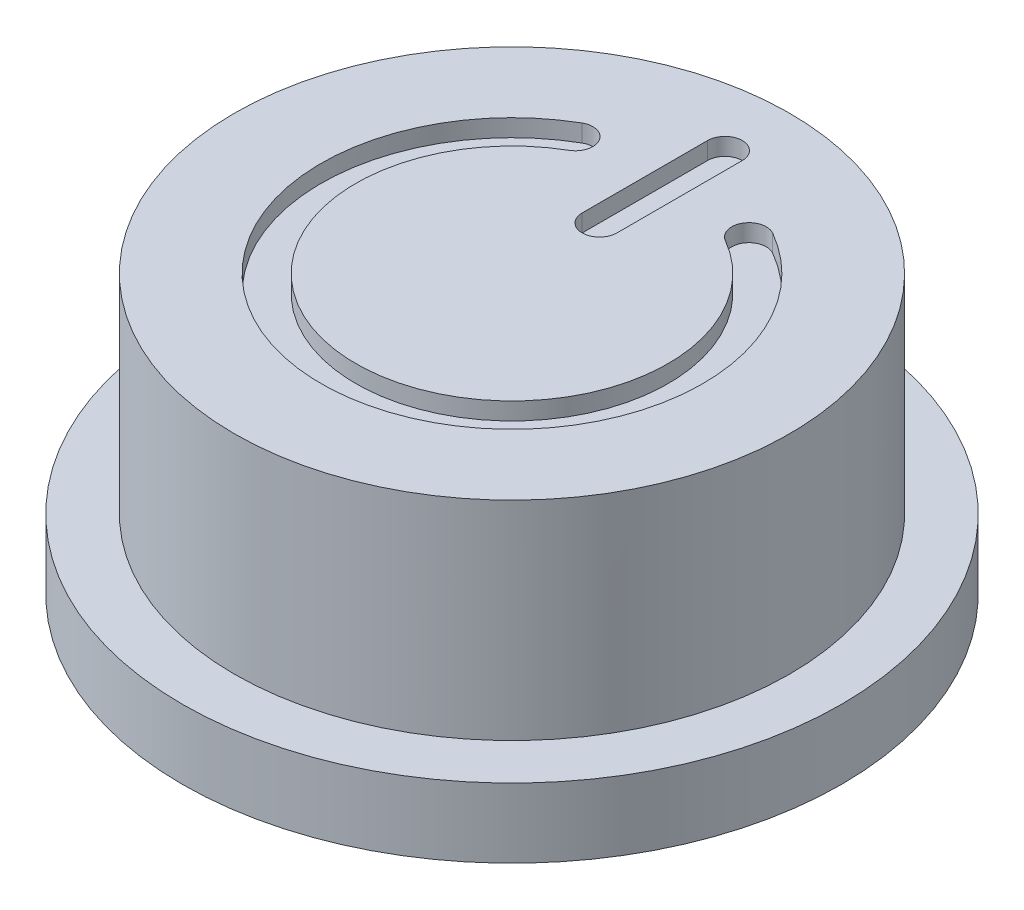
ISO-10303-21;
HEADER;
FILE_DESCRIPTION(('STEP AP214'),'2;1');
FILE_NAME('part.step','',(''),(''),'','','');
FILE_SCHEMA(('AUTOMOTIVE_DESIGN { 1 0 10303 214 1 1 1 1 }'));
ENDSEC;
DATA;
#1=APPLICATION_CONTEXT('core data for automotive mechanical design processes');
#2=APPLICATION_PROTOCOL_DEFINITION('international standard','automotive_design',2000,#1);
#3=PRODUCT_CONTEXT('',#1,'mechanical');
#4=PRODUCT('Part','Part','',(#3));
#5=PRODUCT_RELATED_PRODUCT_CATEGORY('part','',(#4));
#6=PRODUCT_DEFINITION_FORMATION('','',#4);
#7=PRODUCT_DEFINITION_CONTEXT('part definition',#1,'design');
#8=PRODUCT_DEFINITION('design','',#6,#7);
#9=PRODUCT_DEFINITION_SHAPE('','',#8);
#10=(LENGTH_UNIT() NAMED_UNIT(*) SI_UNIT(.MILLI.,.METRE.));
#11=(NAMED_UNIT(*) PLANE_ANGLE_UNIT() SI_UNIT($,.RADIAN.));
#12=(NAMED_UNIT(*) SI_UNIT($,.STERADIAN.) SOLID_ANGLE_UNIT());
#13=UNCERTAINTY_MEASURE_WITH_UNIT(LENGTH_MEASURE(1.E-05),#10,'distance_accuracy_value','');
#14=(GEOMETRIC_REPRESENTATION_CONTEXT(3) GLOBAL_UNCERTAINTY_ASSIGNED_CONTEXT((#13)) GLOBAL_UNIT_ASSIGNED_CONTEXT((#10,
#11,#12)) REPRESENTATION_CONTEXT('',''));
#15=CARTESIAN_POINT('',(0.,0.,0.));
#16=DIRECTION('',(0.,0.,1.));
#17=DIRECTION('',(1.,0.,0.));
#18=AXIS2_PLACEMENT_3D('',#15,#16,#17);
#19=CARTESIAN_POINT('',(0.,6.,0.));
#20=DIRECTION('',(0.,-1.,0.));
#21=DIRECTION('',(0.,0.,-1.));
#22=AXIS2_PLACEMENT_3D('',#19,#20,#21);
#23=CYLINDRICAL_SURFACE('',#22,8.);
#24=DIRECTION('',(0.,-1.,0.));
#25=VECTOR('',#24,1.);
#26=CARTESIAN_POINT('',(-1.24999999999999,6.,-7.90174031463955));
#27=LINE('',#26,#25);
#28=CARTESIAN_POINT('',(-1.24999999999999,0.,-7.90174031463955));
#29=VERTEX_POINT('',#28);
#30=CARTESIAN_POINT('',(-1.24999999999999,-2.,-7.90174031463955));
#31=VERTEX_POINT('',#30);
#32=EDGE_CURVE('E196',#29,#31,#27,.T.);
#33=ORIENTED_EDGE('',*,*,#32,.F.);
#34=CARTESIAN_POINT('',(0.,0.,0.));
#35=DIRECTION('',(0.,-1.,0.));
#36=DIRECTION('',(0.,0.,-1.));
#37=AXIS2_PLACEMENT_3D('',#34,#35,#36);
#38=CIRCLE('',#37,8.);
#39=CARTESIAN_POINT('',(1.25,0.,-7.90174031463955));
#40=VERTEX_POINT('',#39);
#41=EDGE_CURVE('E221',#40,#29,#38,.T.);
#42=ORIENTED_EDGE('',*,*,#41,.F.);
#43=DIRECTION('',(0.,-1.,0.));
#44=VECTOR('',#43,1.);
#45=CARTESIAN_POINT('',(1.25,6.,-7.90174031463955));
#46=LINE('',#45,#44);
#47=CARTESIAN_POINT('',(1.25,-2.,-7.90174031463955));
#48=VERTEX_POINT('',#47);
#49=EDGE_CURVE('E195',#40,#48,#46,.T.);
#50=ORIENTED_EDGE('',*,*,#49,.T.);
#51=CARTESIAN_POINT('',(0.,-2.,0.));
#52=DIRECTION('',(0.,1.,0.));
#53=DIRECTION('',(0.,0.,1.));
#54=AXIS2_PLACEMENT_3D('',#51,#52,#53);
#55=CIRCLE('',#54,8.);
#56=EDGE_CURVE('E192',#48,#31,#55,.T.);
#57=ORIENTED_EDGE('',*,*,#56,.T.);
#58=EDGE_LOOP('',(#33,#42,#50,#57));
#59=FACE_BOUND('',#58,.T.);
#60=CARTESIAN_POINT('',(0.,6.,0.));
#61=DIRECTION('',(0.,1.,0.));
#62=DIRECTION('',(0.,0.,1.));
#63=AXIS2_PLACEMENT_3D('',#60,#61,#62);
#64=CIRCLE('',#63,8.);
#65=CARTESIAN_POINT('',(0.,6.,8.));
#66=VERTEX_POINT('',#65);
#67=EDGE_CURVE('E226',#66,#66,#64,.T.);
#68=ORIENTED_EDGE('',*,*,#67,.F.);
#69=EDGE_LOOP('',(#68));
#70=FACE_BOUND('',#69,.T.);
#71=ADVANCED_FACE('F33',(#59,#70),#23,.T.);
#72=CARTESIAN_POINT('',(0.,6.,0.));
#73=DIRECTION('',(0.,1.,0.));
#74=DIRECTION('',(0.,0.,1.));
#75=AXIS2_PLACEMENT_3D('',#72,#73,#74);
#76=PLANE('',#75);
#77=CARTESIAN_POINT('',(0.,6.,-6.13682895226834));
#78=DIRECTION('',(0.,1.,0.));
#79=DIRECTION('',(0.,0.,1.));
#80=AXIS2_PLACEMENT_3D('',#77,#78,#79);
#81=CIRCLE('',#80,0.5);
#82=CARTESIAN_POINT('',(0.500000000000001,6.,-6.13682895226834));
#83=VERTEX_POINT('',#82);
#84=CARTESIAN_POINT('',(-0.499999999999999,6.,-6.13682895226834));
#85=VERTEX_POINT('',#84);
#86=EDGE_CURVE('E48',#83,#85,#81,.T.);
#87=ORIENTED_EDGE('',*,*,#86,.F.);
#88=DIRECTION('',(0.,0.,-1.));
#89=VECTOR('',#88,1.);
#90=CARTESIAN_POINT('',(0.500000000000001,6.,-6.13682895226834));
#91=LINE('',#90,#89);
#92=CARTESIAN_POINT('',(0.500000000000001,6.,-2.52342508557605));
#93=VERTEX_POINT('',#92);
#94=EDGE_CURVE('E142',#93,#83,#91,.T.);
#95=ORIENTED_EDGE('',*,*,#94,.F.);
#96=CARTESIAN_POINT('',(0.,6.,-2.52342508557605));
#97=DIRECTION('',(0.,1.,0.));
#98=DIRECTION('',(0.,0.,1.));
#99=AXIS2_PLACEMENT_3D('',#96,#97,#98);
#100=CIRCLE('',#99,0.5);
#101=CARTESIAN_POINT('',(-0.5,6.,-2.52342508557605));
#102=VERTEX_POINT('',#101);
#103=EDGE_CURVE('E145',#102,#93,#100,.T.);
#104=ORIENTED_EDGE('',*,*,#103,.F.);
#105=DIRECTION('',(0.,0.,1.));
#106=VECTOR('',#105,1.);
#107=CARTESIAN_POINT('',(-0.499999999999999,6.,-6.13682895226834));
#108=LINE('',#107,#106);
#109=EDGE_CURVE('E151',#85,#102,#108,.T.);
#110=ORIENTED_EDGE('',*,*,#109,.F.);
#111=EDGE_LOOP('',(#87,#95,#104,#110));
#112=FACE_BOUND('',#111,.T.);
#113=CARTESIAN_POINT('',(-2.5,6.,-4.33012701892219));
#114=DIRECTION('',(0.,1.,0.));
#115=DIRECTION('',(0.,0.,1.));
#116=AXIS2_PLACEMENT_3D('',#113,#114,#115);
#117=CIRCLE('',#116,0.499999999999998);
#118=CARTESIAN_POINT('',(-2.25,6.,-3.89711431702998));
#119=VERTEX_POINT('',#118);
#120=CARTESIAN_POINT('',(-2.75,6.,-4.76313972081441));
#121=VERTEX_POINT('',#120);
#122=EDGE_CURVE('E56',#119,#121,#117,.T.);
#123=ORIENTED_EDGE('',*,*,#122,.F.);
#124=CARTESIAN_POINT('',(0.,6.,0.));
#125=DIRECTION('',(0.,-1.,0.));
#126=DIRECTION('',(0.,0.,1.));
#127=AXIS2_PLACEMENT_3D('',#124,#125,#126);
#128=CIRCLE('',#127,4.5);
#129=CARTESIAN_POINT('',(2.25,6.,-3.89711431702997));
#130=VERTEX_POINT('',#129);
#131=EDGE_CURVE('E164',#130,#119,#128,.T.);
#132=ORIENTED_EDGE('',*,*,#131,.F.);
#133=CARTESIAN_POINT('',(2.5,6.,-4.33012701892219));
#134=DIRECTION('',(0.,1.,0.));
#135=DIRECTION('',(0.,0.,1.));
#136=AXIS2_PLACEMENT_3D('',#133,#134,#135);
#137=CIRCLE('',#136,0.499999999999998);
#138=CARTESIAN_POINT('',(2.75,6.,-4.76313972081441));
#139=VERTEX_POINT('',#138);
#140=EDGE_CURVE('E178',#139,#130,#137,.T.);
#141=ORIENTED_EDGE('',*,*,#140,.F.);
#142=CARTESIAN_POINT('',(0.,6.,0.));
#143=DIRECTION('',(0.,1.,0.));
#144=DIRECTION('',(0.,0.,1.));
#145=AXIS2_PLACEMENT_3D('',#142,#143,#144);
#146=CIRCLE('',#145,5.5);
#147=EDGE_CURVE('E175',#121,#139,#146,.T.);
#148=ORIENTED_EDGE('',*,*,#147,.F.);
#149=EDGE_LOOP('',(#123,#132,#141,#148));
#150=FACE_BOUND('',#149,.T.);
#151=ORIENTED_EDGE('',*,*,#67,.T.);
#152=EDGE_LOOP('',(#151));
#153=FACE_BOUND('',#152,.T.);
#154=ADVANCED_FACE('F269',(#112,#150,#153),#76,.T.);
#155=CARTESIAN_POINT('',(0.,0.,0.));
#156=DIRECTION('',(0.,-1.,0.));
#157=DIRECTION('',(0.,0.,-1.));
#158=AXIS2_PLACEMENT_3D('',#155,#156,#157);
#159=PLANE('',#158);
#160=ORIENTED_EDGE('',*,*,#41,.T.);
#161=DIRECTION('',(0.,0.,-1.));
#162=VECTOR('',#161,1.);
#163=CARTESIAN_POINT('',(-1.25,0.,0.));
#164=LINE('',#163,#162);
#165=CARTESIAN_POINT('',(-1.25,0.,-9.41740410091868));
#166=VERTEX_POINT('',#165);
#167=EDGE_CURVE('E208',#29,#166,#164,.T.);
#168=ORIENTED_EDGE('',*,*,#167,.T.);
#169=CARTESIAN_POINT('',(0.,0.,0.));
#170=DIRECTION('',(0.,-1.,0.));
#171=DIRECTION('',(0.,0.,-1.));
#172=AXIS2_PLACEMENT_3D('',#169,#170,#171);
#173=CIRCLE('',#172,9.5);
#174=CARTESIAN_POINT('',(1.25,0.,-9.41740410091868));
#175=VERTEX_POINT('',#174);
#176=EDGE_CURVE('E217',#175,#166,#173,.T.);
#177=ORIENTED_EDGE('',*,*,#176,.F.);
#178=DIRECTION('',(0.,0.,1.));
#179=VECTOR('',#178,1.);
#180=CARTESIAN_POINT('',(1.25,0.,0.));
#181=LINE('',#180,#179);
#182=EDGE_CURVE('E202',#175,#40,#181,.T.);
#183=ORIENTED_EDGE('',*,*,#182,.T.);
#184=EDGE_LOOP('',(#160,#168,#177,#183));
#185=FACE_BOUND('',#184,.T.);
#186=ADVANCED_FACE('F276',(#185),#159,.F.);
#187=CARTESIAN_POINT('',(0.,-2.,0.));
#188=DIRECTION('',(0.,1.,0.));
#189=DIRECTION('',(0.,0.,1.));
#190=AXIS2_PLACEMENT_3D('',#187,#188,#189);
#191=CYLINDRICAL_SURFACE('',#190,9.5);
#192=ORIENTED_EDGE('',*,*,#176,.T.);
#193=DIRECTION('',(0.,1.,0.));
#194=VECTOR('',#193,1.);
#195=CARTESIAN_POINT('',(-1.25,-2.,-9.41740410091868));
#196=LINE('',#195,#194);
#197=CARTESIAN_POINT('',(-1.25,-2.,-9.41740410091868));
#198=VERTEX_POINT('',#197);
#199=EDGE_CURVE('E205',#166,#198,#196,.F.);
#200=ORIENTED_EDGE('',*,*,#199,.T.);
#201=CARTESIAN_POINT('',(0.,-2.,0.));
#202=DIRECTION('',(0.,-1.,0.));
#203=DIRECTION('',(0.,0.,-1.));
#204=AXIS2_PLACEMENT_3D('',#201,#202,#203);
#205=CIRCLE('',#204,9.5);
#206=CARTESIAN_POINT('',(1.25,-2.,-9.41740410091868));
#207=VERTEX_POINT('',#206);
#208=EDGE_CURVE('E218',#207,#198,#205,.T.);
#209=ORIENTED_EDGE('',*,*,#208,.F.);
#210=DIRECTION('',(0.,1.,0.));
#211=VECTOR('',#210,1.);
#212=CARTESIAN_POINT('',(1.25,-2.,-9.41740410091868));
#213=LINE('',#212,#211);
#214=EDGE_CURVE('E198',#207,#175,#213,.T.);
#215=ORIENTED_EDGE('',*,*,#214,.T.);
#216=EDGE_LOOP('',(#192,#200,#209,#215));
#217=FACE_BOUND('',#216,.T.);
#218=ADVANCED_FACE('F266',(#217),#191,.T.);
#219=CARTESIAN_POINT('',(0.,-2.,0.));
#220=DIRECTION('',(0.,-1.,0.));
#221=DIRECTION('',(0.,0.,-1.));
#222=AXIS2_PLACEMENT_3D('',#219,#220,#221);
#223=PLANE('',#222);
#224=DIRECTION('',(0.,0.,-1.));
#225=VECTOR('',#224,1.);
#226=CARTESIAN_POINT('',(-1.25,-2.,-16.5477166425773));
#227=LINE('',#226,#225);
#228=EDGE_CURVE('E185',#31,#198,#227,.T.);
#229=ORIENTED_EDGE('',*,*,#228,.F.);
#230=ORIENTED_EDGE('',*,*,#56,.F.);
#231=DIRECTION('',(0.,0.,1.));
#232=VECTOR('',#231,1.);
#233=CARTESIAN_POINT('',(1.25,-2.,0.));
#234=LINE('',#233,#232);
#235=EDGE_CURVE('E11',#207,#48,#234,.T.);
#236=ORIENTED_EDGE('',*,*,#235,.F.);
#237=ORIENTED_EDGE('',*,*,#208,.T.);
#238=EDGE_LOOP('',(#229,#230,#236,#237));
#239=FACE_BOUND('',#238,.T.);
#240=CARTESIAN_POINT('',(0.,-2.,0.));
#241=DIRECTION('',(0.,-1.,0.));
#242=DIRECTION('',(0.,0.,-1.));
#243=AXIS2_PLACEMENT_3D('',#240,#241,#242);
#244=CIRCLE('',#243,7.25);
#245=CARTESIAN_POINT('',(0.,-2.,-7.25));
#246=VERTEX_POINT('',#245);
#247=EDGE_CURVE('E232',#246,#246,#244,.F.);
#248=ORIENTED_EDGE('',*,*,#247,.T.);
#249=EDGE_LOOP('',(#248));
#250=FACE_BOUND('',#249,.T.);
#251=ADVANCED_FACE('F252',(#239,#250),#223,.T.);
#252=CARTESIAN_POINT('',(0.,3.,0.));
#253=DIRECTION('',(0.,-1.,0.));
#254=DIRECTION('',(0.,0.,-1.));
#255=AXIS2_PLACEMENT_3D('',#252,#253,#254);
#256=CYLINDRICAL_SURFACE('',#255,6.25);
#257=CARTESIAN_POINT('',(0.,-1.,0.));
#258=DIRECTION('',(0.,-1.,0.));
#259=DIRECTION('',(0.,0.,-1.));
#260=AXIS2_PLACEMENT_3D('',#257,#258,#259);
#261=CIRCLE('',#260,6.25);
#262=CARTESIAN_POINT('',(0.,-1.,-6.25));
#263=VERTEX_POINT('',#262);
#264=EDGE_CURVE('E229',#263,#263,#261,.T.);
#265=ORIENTED_EDGE('',*,*,#264,.T.);
#266=EDGE_LOOP('',(#265));
#267=FACE_BOUND('',#266,.T.);
#268=CARTESIAN_POINT('',(0.,3.,0.));
#269=DIRECTION('',(0.,-1.,0.));
#270=DIRECTION('',(0.,0.,-1.));
#271=AXIS2_PLACEMENT_3D('',#268,#269,#270);
#272=CIRCLE('',#271,6.25);
#273=CARTESIAN_POINT('',(0.,3.,-6.25));
#274=VERTEX_POINT('',#273);
#275=EDGE_CURVE('E214',#274,#274,#272,.T.);
#276=ORIENTED_EDGE('',*,*,#275,.F.);
#277=EDGE_LOOP('',(#276));
#278=FACE_BOUND('',#277,.T.);
#279=ADVANCED_FACE('F265',(#267,#278),#256,.F.);
#280=CARTESIAN_POINT('',(0.,3.,0.));
#281=DIRECTION('',(0.,-1.,0.));
#282=DIRECTION('',(0.,0.,-1.));
#283=AXIS2_PLACEMENT_3D('',#280,#281,#282);
#284=PLANE('',#283);
#285=CARTESIAN_POINT('',(0.,3.,0.));
#286=DIRECTION('',(0.,-1.,0.));
#287=DIRECTION('',(0.,0.,-1.));
#288=AXIS2_PLACEMENT_3D('',#285,#286,#287);
#289=CIRCLE('',#288,4.25);
#290=CARTESIAN_POINT('',(0.,3.,-4.25));
#291=VERTEX_POINT('',#290);
#292=EDGE_CURVE('E211',#291,#291,#289,.T.);
#293=ORIENTED_EDGE('',*,*,#292,.F.);
#294=EDGE_LOOP('',(#293));
#295=FACE_BOUND('',#294,.T.);
#296=ORIENTED_EDGE('',*,*,#275,.T.);
#297=EDGE_LOOP('',(#296));
#298=FACE_BOUND('',#297,.T.);
#299=ADVANCED_FACE('F260',(#295,#298),#284,.T.);
#300=CARTESIAN_POINT('',(0.,3.,0.));
#301=DIRECTION('',(0.,-1.,0.));
#302=DIRECTION('',(0.,0.,-1.));
#303=AXIS2_PLACEMENT_3D('',#300,#301,#302);
#304=CYLINDRICAL_SURFACE('',#303,4.25);
#305=CARTESIAN_POINT('',(0.,-0.999999999999998,0.));
#306=DIRECTION('',(0.,-1.,0.));
#307=DIRECTION('',(0.,0.,-1.));
#308=AXIS2_PLACEMENT_3D('',#305,#306,#307);
#309=CIRCLE('',#308,4.25);
#310=CARTESIAN_POINT('',(0.,-0.999999999999998,-4.25));
#311=VERTEX_POINT('',#310);
#312=EDGE_CURVE('E41',#311,#311,#309,.F.);
#313=ORIENTED_EDGE('',*,*,#312,.T.);
#314=EDGE_LOOP('',(#313));
#315=FACE_BOUND('',#314,.T.);
#316=ORIENTED_EDGE('',*,*,#292,.T.);
#317=EDGE_LOOP('',(#316));
#318=FACE_BOUND('',#317,.T.);
#319=ADVANCED_FACE('F240',(#315,#318),#304,.T.);
#320=CARTESIAN_POINT('',(0.,-2.,0.));
#321=DIRECTION('',(0.,-1.,0.));
#322=DIRECTION('',(0.,0.,-1.));
#323=AXIS2_PLACEMENT_3D('',#320,#321,#322);
#324=CIRCLE('',#323,3.25);
#325=CARTESIAN_POINT('',(0.,-2.,-3.25));
#326=VERTEX_POINT('',#325);
#327=EDGE_CURVE('E235',#326,#326,#324,.T.);
#328=ORIENTED_EDGE('',*,*,#327,.T.);
#329=EDGE_LOOP('',(#328));
#330=FACE_BOUND('',#329,.T.);
#331=ADVANCED_FACE('F249',(#330),#223,.T.);
#332=CARTESIAN_POINT('',(0.,-1.,0.));
#333=DIRECTION('',(0.,-1.,0.));
#334=DIRECTION('',(0.,0.,-1.));
#335=AXIS2_PLACEMENT_3D('',#332,#333,#334);
#336=CONICAL_SURFACE('',#335,6.25,0.785398163397451);
#337=ORIENTED_EDGE('',*,*,#247,.F.);
#338=EDGE_LOOP('',(#337));
#339=FACE_BOUND('',#338,.T.);
#340=ORIENTED_EDGE('',*,*,#264,.F.);
#341=EDGE_LOOP('',(#340));
#342=FACE_BOUND('',#341,.T.);
#343=ADVANCED_FACE('F246',(#339,#342),#336,.F.);
#344=CARTESIAN_POINT('',(0.,-2.,0.));
#345=DIRECTION('',(0.,1.,0.));
#346=DIRECTION('',(0.,0.,1.));
#347=AXIS2_PLACEMENT_3D('',#344,#345,#346);
#348=CONICAL_SURFACE('',#347,3.25,0.785398163397446);
#349=ORIENTED_EDGE('',*,*,#312,.F.);
#350=EDGE_LOOP('',(#349));
#351=FACE_BOUND('',#350,.T.);
#352=ORIENTED_EDGE('',*,*,#327,.F.);
#353=EDGE_LOOP('',(#352));
#354=FACE_BOUND('',#353,.T.);
#355=ADVANCED_FACE('F35',(#351,#354),#348,.T.);
#356=CARTESIAN_POINT('',(-1.25,6.,-16.5477166425773));
#357=DIRECTION('',(-1.,0.,0.));
#358=DIRECTION('',(0.,0.,1.));
#359=AXIS2_PLACEMENT_3D('',#356,#357,#358);
#360=PLANE('',#359);
#361=ORIENTED_EDGE('',*,*,#32,.T.);
#362=ORIENTED_EDGE('',*,*,#228,.T.);
#363=ORIENTED_EDGE('',*,*,#199,.F.);
#364=ORIENTED_EDGE('',*,*,#167,.F.);
#365=EDGE_LOOP('',(#361,#362,#363,#364));
#366=FACE_BOUND('',#365,.T.);
#367=ADVANCED_FACE('F245',(#366),#360,.F.);
#368=CARTESIAN_POINT('',(1.25,6.,-16.5477166425773));
#369=DIRECTION('',(1.,0.,0.));
#370=DIRECTION('',(0.,0.,-1.));
#371=AXIS2_PLACEMENT_3D('',#368,#369,#370);
#372=PLANE('',#371);
#373=ORIENTED_EDGE('',*,*,#214,.F.);
#374=ORIENTED_EDGE('',*,*,#235,.T.);
#375=ORIENTED_EDGE('',*,*,#49,.F.);
#376=ORIENTED_EDGE('',*,*,#182,.F.);
#377=EDGE_LOOP('',(#373,#374,#375,#376));
#378=FACE_BOUND('',#377,.T.);
#379=ADVANCED_FACE('F297',(#378),#372,.F.);
#380=CARTESIAN_POINT('',(-2.5,5.5,-4.33012701892219));
#381=DIRECTION('',(0.,1.,0.));
#382=DIRECTION('',(0.,0.,1.));
#383=AXIS2_PLACEMENT_3D('',#380,#381,#382);
#384=CYLINDRICAL_SURFACE('',#383,0.499999999999998);
#385=ORIENTED_EDGE('',*,*,#122,.T.);
#386=DIRECTION('',(0.,1.,0.));
#387=VECTOR('',#386,1.);
#388=CARTESIAN_POINT('',(-2.75,5.5,-4.76313972081441));
#389=LINE('',#388,#387);
#390=CARTESIAN_POINT('',(-2.75,5.5,-4.76313972081441));
#391=VERTEX_POINT('',#390);
#392=EDGE_CURVE('E173',#391,#121,#389,.T.);
#393=ORIENTED_EDGE('',*,*,#392,.F.);
#394=CARTESIAN_POINT('',(-2.5,5.5,-4.33012701892219));
#395=DIRECTION('',(0.,1.,0.));
#396=DIRECTION('',(0.,0.,1.));
#397=AXIS2_PLACEMENT_3D('',#394,#395,#396);
#398=CIRCLE('',#397,0.499999999999998);
#399=CARTESIAN_POINT('',(-2.25,5.5,-3.89711431702998));
#400=VERTEX_POINT('',#399);
#401=EDGE_CURVE('E160',#400,#391,#398,.T.);
#402=ORIENTED_EDGE('',*,*,#401,.F.);
#403=DIRECTION('',(0.,1.,0.));
#404=VECTOR('',#403,1.);
#405=CARTESIAN_POINT('',(-2.25,5.5,-3.89711431702998));
#406=LINE('',#405,#404);
#407=EDGE_CURVE('E183',#400,#119,#406,.T.);
#408=ORIENTED_EDGE('',*,*,#407,.T.);
#409=EDGE_LOOP('',(#385,#393,#402,#408));
#410=FACE_BOUND('',#409,.T.);
#411=ADVANCED_FACE('F299',(#410),#384,.F.);
#412=CARTESIAN_POINT('',(0.,5.5,0.));
#413=DIRECTION('',(0.,1.,0.));
#414=DIRECTION('',(0.,0.,1.));
#415=AXIS2_PLACEMENT_3D('',#412,#413,#414);
#416=CYLINDRICAL_SURFACE('',#415,4.5);
#417=ORIENTED_EDGE('',*,*,#131,.T.);
#418=ORIENTED_EDGE('',*,*,#407,.F.);
#419=CARTESIAN_POINT('',(0.,5.5,0.));
#420=DIRECTION('',(0.,-1.,0.));
#421=DIRECTION('',(0.,0.,1.));
#422=AXIS2_PLACEMENT_3D('',#419,#420,#421);
#423=CIRCLE('',#422,4.5);
#424=CARTESIAN_POINT('',(2.25,5.5,-3.89711431702997));
#425=VERTEX_POINT('',#424);
#426=EDGE_CURVE('E170',#425,#400,#423,.T.);
#427=ORIENTED_EDGE('',*,*,#426,.F.);
#428=DIRECTION('',(0.,1.,0.));
#429=VECTOR('',#428,1.);
#430=CARTESIAN_POINT('',(2.25,5.5,-3.89711431702997));
#431=LINE('',#430,#429);
#432=EDGE_CURVE('E186',#425,#130,#431,.T.);
#433=ORIENTED_EDGE('',*,*,#432,.T.);
#434=EDGE_LOOP('',(#417,#418,#427,#433));
#435=FACE_BOUND('',#434,.T.);
#436=ADVANCED_FACE('F304',(#435),#416,.T.);
#437=CARTESIAN_POINT('',(2.5,5.5,-4.33012701892219));
#438=DIRECTION('',(0.,1.,0.));
#439=DIRECTION('',(0.,0.,1.));
#440=AXIS2_PLACEMENT_3D('',#437,#438,#439);
#441=CYLINDRICAL_SURFACE('',#440,0.499999999999998);
#442=ORIENTED_EDGE('',*,*,#140,.T.);
#443=ORIENTED_EDGE('',*,*,#432,.F.);
#444=CARTESIAN_POINT('',(2.5,5.5,-4.33012701892219));
#445=DIRECTION('',(0.,1.,0.));
#446=DIRECTION('',(0.,0.,1.));
#447=AXIS2_PLACEMENT_3D('',#444,#445,#446);
#448=CIRCLE('',#447,0.499999999999998);
#449=CARTESIAN_POINT('',(2.75,5.5,-4.76313972081441));
#450=VERTEX_POINT('',#449);
#451=EDGE_CURVE('E167',#450,#425,#448,.T.);
#452=ORIENTED_EDGE('',*,*,#451,.F.);
#453=DIRECTION('',(0.,1.,0.));
#454=VECTOR('',#453,1.);
#455=CARTESIAN_POINT('',(2.75,5.5,-4.76313972081441));
#456=LINE('',#455,#454);
#457=EDGE_CURVE('E188',#450,#139,#456,.T.);
#458=ORIENTED_EDGE('',*,*,#457,.T.);
#459=EDGE_LOOP('',(#442,#443,#452,#458));
#460=FACE_BOUND('',#459,.T.);
#461=ADVANCED_FACE('F369',(#460),#441,.F.);
#462=CARTESIAN_POINT('',(0.,5.5,0.));
#463=DIRECTION('',(0.,1.,0.));
#464=DIRECTION('',(0.,0.,1.));
#465=AXIS2_PLACEMENT_3D('',#462,#463,#464);
#466=CYLINDRICAL_SURFACE('',#465,5.5);
#467=ORIENTED_EDGE('',*,*,#147,.T.);
#468=ORIENTED_EDGE('',*,*,#457,.F.);
#469=CARTESIAN_POINT('',(0.,5.5,0.));
#470=DIRECTION('',(0.,1.,0.));
#471=DIRECTION('',(0.,0.,1.));
#472=AXIS2_PLACEMENT_3D('',#469,#470,#471);
#473=CIRCLE('',#472,5.5);
#474=EDGE_CURVE('E163',#391,#450,#473,.T.);
#475=ORIENTED_EDGE('',*,*,#474,.F.);
#476=ORIENTED_EDGE('',*,*,#392,.T.);
#477=EDGE_LOOP('',(#467,#468,#475,#476));
#478=FACE_BOUND('',#477,.T.);
#479=ADVANCED_FACE('F378',(#478),#466,.F.);
#480=CARTESIAN_POINT('',(-1.25,5.5,-2.1650635094611));
#481=DIRECTION('',(0.,1.,0.));
#482=DIRECTION('',(0.,0.,1.));
#483=AXIS2_PLACEMENT_3D('',#480,#481,#482);
#484=PLANE('',#483);
#485=ORIENTED_EDGE('',*,*,#401,.T.);
#486=ORIENTED_EDGE('',*,*,#474,.T.);
#487=ORIENTED_EDGE('',*,*,#451,.T.);
#488=ORIENTED_EDGE('',*,*,#426,.T.);
#489=EDGE_LOOP('',(#485,#486,#487,#488));
#490=FACE_BOUND('',#489,.T.);
#491=ADVANCED_FACE('F387',(#490),#484,.T.);
#492=CARTESIAN_POINT('',(0.,5.5,-6.13682895226834));
#493=DIRECTION('',(0.,1.,0.));
#494=DIRECTION('',(0.,0.,1.));
#495=AXIS2_PLACEMENT_3D('',#492,#493,#494);
#496=CYLINDRICAL_SURFACE('',#495,0.5);
#497=ORIENTED_EDGE('',*,*,#86,.T.);
#498=DIRECTION('',(0.,1.,0.));
#499=VECTOR('',#498,1.);
#500=CARTESIAN_POINT('',(-0.499999999999999,5.5,-6.13682895226834));
#501=LINE('',#500,#499);
#502=CARTESIAN_POINT('',(-0.499999999999999,5.5,-6.13682895226834));
#503=VERTEX_POINT('',#502);
#504=EDGE_CURVE('E120',#503,#85,#501,.T.);
#505=ORIENTED_EDGE('',*,*,#504,.F.);
#506=CARTESIAN_POINT('',(0.,5.5,-6.13682895226834));
#507=DIRECTION('',(0.,1.,0.));
#508=DIRECTION('',(0.,0.,1.));
#509=AXIS2_PLACEMENT_3D('',#506,#507,#508);
#510=CIRCLE('',#509,0.5);
#511=CARTESIAN_POINT('',(0.500000000000001,5.5,-6.13682895226834));
#512=VERTEX_POINT('',#511);
#513=EDGE_CURVE('E124',#512,#503,#510,.T.);
#514=ORIENTED_EDGE('',*,*,#513,.F.);
#515=DIRECTION('',(0.,1.,0.));
#516=VECTOR('',#515,1.);
#517=CARTESIAN_POINT('',(0.500000000000001,5.5,-6.13682895226834));
#518=LINE('',#517,#516);
#519=EDGE_CURVE('E155',#512,#83,#518,.T.);
#520=ORIENTED_EDGE('',*,*,#519,.T.);
#521=EDGE_LOOP('',(#497,#505,#514,#520));
#522=FACE_BOUND('',#521,.T.);
#523=ADVANCED_FACE('F122',(#522),#496,.F.);
#524=CARTESIAN_POINT('',(0.500000000000001,5.5,-6.13682895226834));
#525=DIRECTION('',(1.,0.,0.));
#526=DIRECTION('',(0.,0.,-1.));
#527=AXIS2_PLACEMENT_3D('',#524,#525,#526);
#528=PLANE('',#527);
#529=ORIENTED_EDGE('',*,*,#94,.T.);
#530=ORIENTED_EDGE('',*,*,#519,.F.);
#531=DIRECTION('',(0.,0.,-1.));
#532=VECTOR('',#531,1.);
#533=CARTESIAN_POINT('',(0.500000000000001,5.5,-6.13682895226834));
#534=LINE('',#533,#532);
#535=CARTESIAN_POINT('',(0.500000000000001,5.5,-2.52342508557605));
#536=VERTEX_POINT('',#535);
#537=EDGE_CURVE('E130',#536,#512,#534,.T.);
#538=ORIENTED_EDGE('',*,*,#537,.F.);
#539=DIRECTION('',(0.,1.,0.));
#540=VECTOR('',#539,1.);
#541=CARTESIAN_POINT('',(0.500000000000001,5.5,-2.52342508557605));
#542=LINE('',#541,#540);
#543=EDGE_CURVE('E157',#536,#93,#542,.T.);
#544=ORIENTED_EDGE('',*,*,#543,.T.);
#545=EDGE_LOOP('',(#529,#530,#538,#544));
#546=FACE_BOUND('',#545,.T.);
#547=ADVANCED_FACE('F403',(#546),#528,.F.);
#548=CARTESIAN_POINT('',(0.,5.5,-2.52342508557605));
#549=DIRECTION('',(0.,1.,0.));
#550=DIRECTION('',(0.,0.,1.));
#551=AXIS2_PLACEMENT_3D('',#548,#549,#550);
#552=CYLINDRICAL_SURFACE('',#551,0.5);
#553=ORIENTED_EDGE('',*,*,#103,.T.);
#554=ORIENTED_EDGE('',*,*,#543,.F.);
#555=CARTESIAN_POINT('',(0.,5.5,-2.52342508557605));
#556=DIRECTION('',(0.,1.,0.));
#557=DIRECTION('',(0.,0.,1.));
#558=AXIS2_PLACEMENT_3D('',#555,#556,#557);
#559=CIRCLE('',#558,0.5);
#560=CARTESIAN_POINT('',(-0.5,5.5,-2.52342508557605));
#561=VERTEX_POINT('',#560);
#562=EDGE_CURVE('E138',#561,#536,#559,.T.);
#563=ORIENTED_EDGE('',*,*,#562,.F.);
#564=DIRECTION('',(0.,1.,0.));
#565=VECTOR('',#564,1.);
#566=CARTESIAN_POINT('',(-0.5,5.5,-2.52342508557605));
#567=LINE('',#566,#565);
#568=EDGE_CURVE('E129',#561,#102,#567,.T.);
#569=ORIENTED_EDGE('',*,*,#568,.T.);
#570=EDGE_LOOP('',(#553,#554,#563,#569));
#571=FACE_BOUND('',#570,.T.);
#572=ADVANCED_FACE('F411',(#571),#552,.F.);
#573=CARTESIAN_POINT('',(-0.499999999999999,5.5,-6.13682895226834));
#574=DIRECTION('',(-1.,0.,0.));
#575=DIRECTION('',(0.,0.,1.));
#576=AXIS2_PLACEMENT_3D('',#573,#574,#575);
#577=PLANE('',#576);
#578=ORIENTED_EDGE('',*,*,#109,.T.);
#579=ORIENTED_EDGE('',*,*,#568,.F.);
#580=DIRECTION('',(0.,0.,1.));
#581=VECTOR('',#580,1.);
#582=CARTESIAN_POINT('',(-0.499999999999999,5.5,-6.13682895226834));
#583=LINE('',#582,#581);
#584=EDGE_CURVE('E133',#503,#561,#583,.T.);
#585=ORIENTED_EDGE('',*,*,#584,.F.);
#586=ORIENTED_EDGE('',*,*,#504,.T.);
#587=EDGE_LOOP('',(#578,#579,#585,#586));
#588=FACE_BOUND('',#587,.T.);
#589=ADVANCED_FACE('F134',(#588),#577,.F.);
#590=CARTESIAN_POINT('',(0.,5.5,-6.13682895226834));
#591=DIRECTION('',(0.,1.,0.));
#592=DIRECTION('',(0.,0.,1.));
#593=AXIS2_PLACEMENT_3D('',#590,#591,#592);
#594=PLANE('',#593);
#595=ORIENTED_EDGE('',*,*,#513,.T.);
#596=ORIENTED_EDGE('',*,*,#584,.T.);
#597=ORIENTED_EDGE('',*,*,#562,.T.);
#598=ORIENTED_EDGE('',*,*,#537,.T.);
#599=EDGE_LOOP('',(#595,#596,#597,#598));
#600=FACE_BOUND('',#599,.T.);
#601=ADVANCED_FACE('F140',(#600),#594,.T.);
#602=CLOSED_SHELL('',(#71,#154,#186,#218,#251,#279,#299,#319,#331,#343,#355,#367,#379,#411,#436,
#461,#479,#491,#523,#547,#572,#589,#601));
#603=MANIFOLD_SOLID_BREP('B2',#602);
#604=ADVANCED_BREP_SHAPE_REPRESENTATION('',(#18,#603),#14);
#605=SHAPE_DEFINITION_REPRESENTATION(#9,#604);
ENDSEC;
END-ISO-10303-21;
